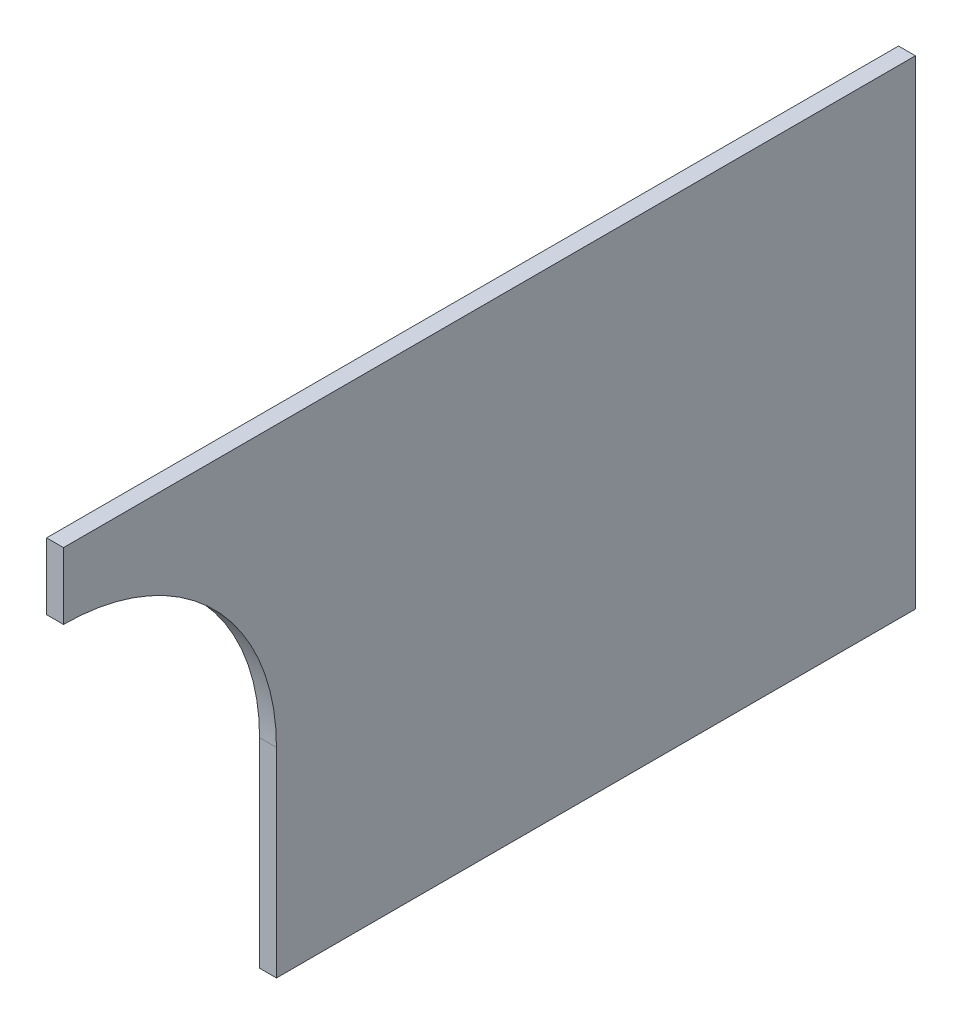
ISO-10303-21;
HEADER;
FILE_DESCRIPTION(('STEP AP214'),'2;1');
FILE_NAME('part.step','',(''),(''),'','','');
FILE_SCHEMA(('AUTOMOTIVE_DESIGN { 1 0 10303 214 1 1 1 1 }'));
ENDSEC;
DATA;
#1=APPLICATION_CONTEXT('core data for automotive mechanical design processes');
#2=APPLICATION_PROTOCOL_DEFINITION('international standard','automotive_design',2000,#1);
#3=PRODUCT_CONTEXT('',#1,'mechanical');
#4=PRODUCT('Part','Part','',(#3));
#5=PRODUCT_RELATED_PRODUCT_CATEGORY('part','',(#4));
#6=PRODUCT_DEFINITION_FORMATION('','',#4);
#7=PRODUCT_DEFINITION_CONTEXT('part definition',#1,'design');
#8=PRODUCT_DEFINITION('design','',#6,#7);
#9=PRODUCT_DEFINITION_SHAPE('','',#8);
#10=(LENGTH_UNIT() NAMED_UNIT(*) SI_UNIT(.MILLI.,.METRE.));
#11=(NAMED_UNIT(*) PLANE_ANGLE_UNIT() SI_UNIT($,.RADIAN.));
#12=(NAMED_UNIT(*) SI_UNIT($,.STERADIAN.) SOLID_ANGLE_UNIT());
#13=UNCERTAINTY_MEASURE_WITH_UNIT(LENGTH_MEASURE(1.E-05),#10,'distance_accuracy_value','');
#14=(GEOMETRIC_REPRESENTATION_CONTEXT(3) GLOBAL_UNCERTAINTY_ASSIGNED_CONTEXT((#13)) GLOBAL_UNIT_ASSIGNED_CONTEXT((#10,
#11,#12)) REPRESENTATION_CONTEXT('',''));
#15=CARTESIAN_POINT('',(0.,0.,0.));
#16=DIRECTION('',(0.,0.,1.));
#17=DIRECTION('',(1.,0.,0.));
#18=AXIS2_PLACEMENT_3D('',#15,#16,#17);
#19=CARTESIAN_POINT('',(6.35,0.,-240.));
#20=DIRECTION('',(0.,1.,0.));
#21=DIRECTION('',(0.,0.,1.));
#22=AXIS2_PLACEMENT_3D('',#19,#20,#21);
#23=PLANE('',#22);
#24=DIRECTION('',(0.,0.,-1.));
#25=VECTOR('',#24,1.);
#26=CARTESIAN_POINT('',(0.,0.,-240.));
#27=LINE('',#26,#25);
#28=CARTESIAN_POINT('',(0.,0.,0.));
#29=VERTEX_POINT('',#28);
#30=CARTESIAN_POINT('',(0.,0.,-240.));
#31=VERTEX_POINT('',#30);
#32=EDGE_CURVE('E121',#29,#31,#27,.T.);
#33=ORIENTED_EDGE('',*,*,#32,.T.);
#34=DIRECTION('',(-1.,0.,0.));
#35=VECTOR('',#34,1.);
#36=CARTESIAN_POINT('',(6.35,0.,-240.));
#37=LINE('',#36,#35);
#38=CARTESIAN_POINT('',(6.35,0.,-240.));
#39=VERTEX_POINT('',#38);
#40=EDGE_CURVE('E11',#39,#31,#37,.T.);
#41=ORIENTED_EDGE('',*,*,#40,.F.);
#42=DIRECTION('',(0.,0.,-1.));
#43=VECTOR('',#42,1.);
#44=CARTESIAN_POINT('',(6.35,0.,-240.));
#45=LINE('',#44,#43);
#46=CARTESIAN_POINT('',(6.35,0.,0.));
#47=VERTEX_POINT('',#46);
#48=EDGE_CURVE('E131',#47,#39,#45,.T.);
#49=ORIENTED_EDGE('',*,*,#48,.F.);
#50=DIRECTION('',(-1.,0.,0.));
#51=VECTOR('',#50,1.);
#52=CARTESIAN_POINT('',(6.35,0.,0.));
#53=LINE('',#52,#51);
#54=EDGE_CURVE('E117',#47,#29,#53,.T.);
#55=ORIENTED_EDGE('',*,*,#54,.T.);
#56=EDGE_LOOP('',(#33,#41,#49,#55));
#57=FACE_BOUND('',#56,.T.);
#58=ADVANCED_FACE('F37',(#57),#23,.F.);
#59=CARTESIAN_POINT('',(6.35,180.,-240.));
#60=DIRECTION('',(0.,0.,1.));
#61=DIRECTION('',(0.,-1.,0.));
#62=AXIS2_PLACEMENT_3D('',#59,#60,#61);
#63=PLANE('',#62);
#64=DIRECTION('',(0.,1.,0.));
#65=VECTOR('',#64,1.);
#66=CARTESIAN_POINT('',(0.,180.,-240.));
#67=LINE('',#66,#65);
#68=CARTESIAN_POINT('',(0.,180.,-240.));
#69=VERTEX_POINT('',#68);
#70=EDGE_CURVE('E124',#31,#69,#67,.T.);
#71=ORIENTED_EDGE('',*,*,#70,.T.);
#72=DIRECTION('',(-1.,0.,0.));
#73=VECTOR('',#72,1.);
#74=CARTESIAN_POINT('',(6.35,180.,-240.));
#75=LINE('',#74,#73);
#76=CARTESIAN_POINT('',(6.35,180.,-240.));
#77=VERTEX_POINT('',#76);
#78=EDGE_CURVE('E45',#77,#69,#75,.T.);
#79=ORIENTED_EDGE('',*,*,#78,.F.);
#80=DIRECTION('',(0.,1.,0.));
#81=VECTOR('',#80,1.);
#82=CARTESIAN_POINT('',(6.35,180.,-240.));
#83=LINE('',#82,#81);
#84=EDGE_CURVE('E90',#39,#77,#83,.T.);
#85=ORIENTED_EDGE('',*,*,#84,.F.);
#86=ORIENTED_EDGE('',*,*,#40,.T.);
#87=EDGE_LOOP('',(#71,#79,#85,#86));
#88=FACE_BOUND('',#87,.T.);
#89=ADVANCED_FACE('F155',(#88),#63,.F.);
#90=CARTESIAN_POINT('',(6.35,180.,80.));
#91=DIRECTION('',(0.,-1.,0.));
#92=DIRECTION('',(0.,0.,-1.));
#93=AXIS2_PLACEMENT_3D('',#90,#91,#92);
#94=PLANE('',#93);
#95=DIRECTION('',(0.,0.,1.));
#96=VECTOR('',#95,1.);
#97=CARTESIAN_POINT('',(0.,180.,80.));
#98=LINE('',#97,#96);
#99=CARTESIAN_POINT('',(0.,180.,80.));
#100=VERTEX_POINT('',#99);
#101=EDGE_CURVE('E126',#69,#100,#98,.T.);
#102=ORIENTED_EDGE('',*,*,#101,.T.);
#103=DIRECTION('',(-1.,0.,0.));
#104=VECTOR('',#103,1.);
#105=CARTESIAN_POINT('',(6.35,180.,80.));
#106=LINE('',#105,#104);
#107=CARTESIAN_POINT('',(6.35,180.,80.));
#108=VERTEX_POINT('',#107);
#109=EDGE_CURVE('E112',#108,#100,#106,.T.);
#110=ORIENTED_EDGE('',*,*,#109,.F.);
#111=DIRECTION('',(0.,0.,1.));
#112=VECTOR('',#111,1.);
#113=CARTESIAN_POINT('',(6.35,180.,80.));
#114=LINE('',#113,#112);
#115=EDGE_CURVE('E103',#77,#108,#114,.T.);
#116=ORIENTED_EDGE('',*,*,#115,.F.);
#117=ORIENTED_EDGE('',*,*,#78,.T.);
#118=EDGE_LOOP('',(#102,#110,#116,#117));
#119=FACE_BOUND('',#118,.T.);
#120=ADVANCED_FACE('F137',(#119),#94,.F.);
#121=CARTESIAN_POINT('',(6.35,155.,80.));
#122=DIRECTION('',(0.,0.,-1.));
#123=DIRECTION('',(-1.,0.,0.));
#124=AXIS2_PLACEMENT_3D('',#121,#122,#123);
#125=PLANE('',#124);
#126=DIRECTION('',(0.,-1.,0.));
#127=VECTOR('',#126,1.);
#128=CARTESIAN_POINT('',(0.,155.,80.));
#129=LINE('',#128,#127);
#130=CARTESIAN_POINT('',(0.,155.,80.));
#131=VERTEX_POINT('',#130);
#132=EDGE_CURVE('E111',#100,#131,#129,.T.);
#133=ORIENTED_EDGE('',*,*,#132,.T.);
#134=DIRECTION('',(-1.,0.,0.));
#135=VECTOR('',#134,1.);
#136=CARTESIAN_POINT('',(6.35,155.,80.));
#137=LINE('',#136,#135);
#138=CARTESIAN_POINT('',(6.35,155.,80.));
#139=VERTEX_POINT('',#138);
#140=EDGE_CURVE('E108',#139,#131,#137,.T.);
#141=ORIENTED_EDGE('',*,*,#140,.F.);
#142=DIRECTION('',(0.,-1.,0.));
#143=VECTOR('',#142,1.);
#144=CARTESIAN_POINT('',(6.35,155.,80.));
#145=LINE('',#144,#143);
#146=EDGE_CURVE('E97',#108,#139,#145,.T.);
#147=ORIENTED_EDGE('',*,*,#146,.F.);
#148=ORIENTED_EDGE('',*,*,#109,.T.);
#149=EDGE_LOOP('',(#133,#141,#147,#148));
#150=FACE_BOUND('',#149,.T.);
#151=ADVANCED_FACE('F109',(#150),#125,.F.);
#152=CARTESIAN_POINT('',(6.35,75.,80.));
#153=DIRECTION('',(-1.,0.,0.));
#154=DIRECTION('',(0.,0.,1.));
#155=AXIS2_PLACEMENT_3D('',#152,#153,#154);
#156=CYLINDRICAL_SURFACE('',#155,80.);
#157=CARTESIAN_POINT('',(0.,75.,80.));
#158=DIRECTION('',(-1.,0.,0.));
#159=DIRECTION('',(0.,0.,-1.));
#160=AXIS2_PLACEMENT_3D('',#157,#158,#159);
#161=CIRCLE('',#160,80.);
#162=CARTESIAN_POINT('',(0.,75.,0.));
#163=VERTEX_POINT('',#162);
#164=EDGE_CURVE('E76',#131,#163,#161,.T.);
#165=ORIENTED_EDGE('',*,*,#164,.T.);
#166=DIRECTION('',(-1.,0.,0.));
#167=VECTOR('',#166,1.);
#168=CARTESIAN_POINT('',(6.35,75.,0.));
#169=LINE('',#168,#167);
#170=CARTESIAN_POINT('',(6.35,75.,0.));
#171=VERTEX_POINT('',#170);
#172=EDGE_CURVE('E113',#171,#163,#169,.T.);
#173=ORIENTED_EDGE('',*,*,#172,.F.);
#174=CARTESIAN_POINT('',(6.35,75.,80.));
#175=DIRECTION('',(-1.,0.,0.));
#176=DIRECTION('',(0.,0.,-1.));
#177=AXIS2_PLACEMENT_3D('',#174,#175,#176);
#178=CIRCLE('',#177,80.);
#179=EDGE_CURVE('E101',#139,#171,#178,.T.);
#180=ORIENTED_EDGE('',*,*,#179,.F.);
#181=ORIENTED_EDGE('',*,*,#140,.T.);
#182=EDGE_LOOP('',(#165,#173,#180,#181));
#183=FACE_BOUND('',#182,.T.);
#184=ADVANCED_FACE('F115',(#183),#156,.F.);
#185=CARTESIAN_POINT('',(6.35,0.,0.));
#186=DIRECTION('',(0.,0.,-1.));
#187=DIRECTION('',(-1.,0.,0.));
#188=AXIS2_PLACEMENT_3D('',#185,#186,#187);
#189=PLANE('',#188);
#190=DIRECTION('',(0.,-1.,0.));
#191=VECTOR('',#190,1.);
#192=CARTESIAN_POINT('',(0.,0.,0.));
#193=LINE('',#192,#191);
#194=EDGE_CURVE('E82',#163,#29,#193,.T.);
#195=ORIENTED_EDGE('',*,*,#194,.T.);
#196=ORIENTED_EDGE('',*,*,#54,.F.);
#197=DIRECTION('',(0.,-1.,0.));
#198=VECTOR('',#197,1.);
#199=CARTESIAN_POINT('',(6.35,0.,0.));
#200=LINE('',#199,#198);
#201=EDGE_CURVE('E53',#171,#47,#200,.T.);
#202=ORIENTED_EDGE('',*,*,#201,.F.);
#203=ORIENTED_EDGE('',*,*,#172,.T.);
#204=EDGE_LOOP('',(#195,#196,#202,#203));
#205=FACE_BOUND('',#204,.T.);
#206=ADVANCED_FACE('F144',(#205),#189,.F.);
#207=CARTESIAN_POINT('',(6.35,75.,80.));
#208=DIRECTION('',(1.,0.,0.));
#209=DIRECTION('',(0.,0.,-1.));
#210=AXIS2_PLACEMENT_3D('',#207,#208,#209);
#211=PLANE('',#210);
#212=ORIENTED_EDGE('',*,*,#48,.T.);
#213=ORIENTED_EDGE('',*,*,#84,.T.);
#214=ORIENTED_EDGE('',*,*,#115,.T.);
#215=ORIENTED_EDGE('',*,*,#146,.T.);
#216=ORIENTED_EDGE('',*,*,#179,.T.);
#217=ORIENTED_EDGE('',*,*,#201,.T.);
#218=EDGE_LOOP('',(#212,#213,#214,#215,#216,#217));
#219=FACE_BOUND('',#218,.T.);
#220=ADVANCED_FACE('F99',(#219),#211,.T.);
#221=CARTESIAN_POINT('',(0.,75.,80.));
#222=DIRECTION('',(1.,0.,0.));
#223=DIRECTION('',(0.,0.,-1.));
#224=AXIS2_PLACEMENT_3D('',#221,#222,#223);
#225=PLANE('',#224);
#226=ORIENTED_EDGE('',*,*,#32,.F.);
#227=ORIENTED_EDGE('',*,*,#194,.F.);
#228=ORIENTED_EDGE('',*,*,#164,.F.);
#229=ORIENTED_EDGE('',*,*,#132,.F.);
#230=ORIENTED_EDGE('',*,*,#101,.F.);
#231=ORIENTED_EDGE('',*,*,#70,.F.);
#232=EDGE_LOOP('',(#226,#227,#228,#229,#230,#231));
#233=FACE_BOUND('',#232,.T.);
#234=ADVANCED_FACE('F140',(#233),#225,.F.);
#235=CLOSED_SHELL('',(#58,#89,#120,#151,#184,#206,#220,#234));
#236=MANIFOLD_SOLID_BREP('B2',#235);
#237=ADVANCED_BREP_SHAPE_REPRESENTATION('',(#18,#236),#14);
#238=SHAPE_DEFINITION_REPRESENTATION(#9,#237);
ENDSEC;
END-ISO-10303-21;
